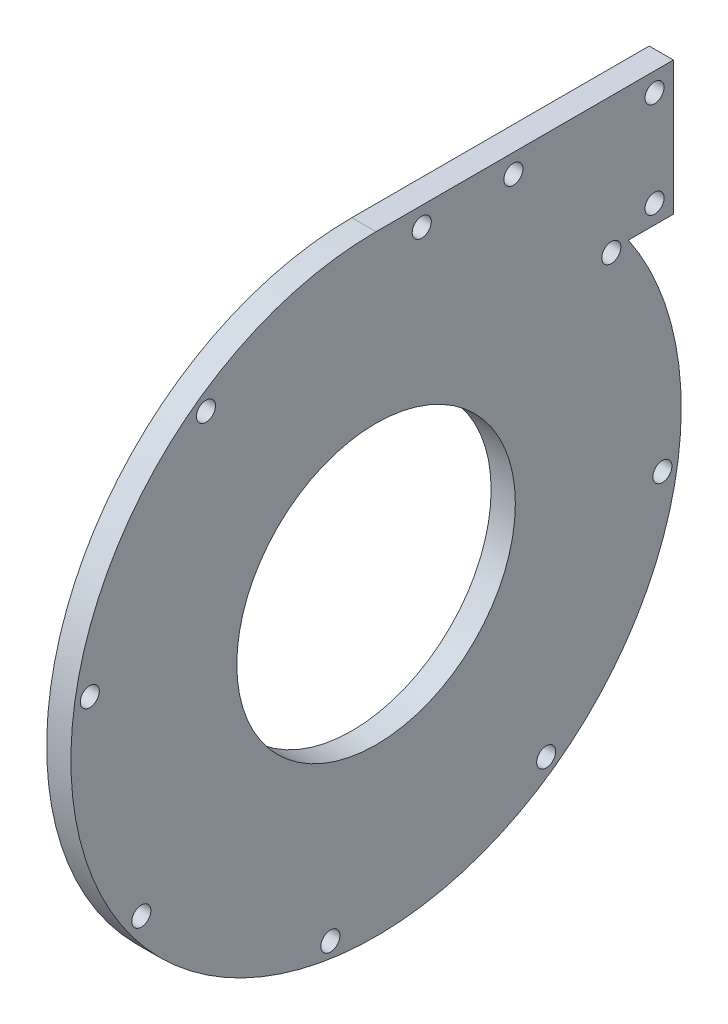
ISO-10303-21;
HEADER;
FILE_DESCRIPTION(('STEP AP214'),'2;1');
FILE_NAME('part.step','',(''),(''),'','','');
FILE_SCHEMA(('AUTOMOTIVE_DESIGN { 1 0 10303 214 1 1 1 1 }'));
ENDSEC;
DATA;
#1=APPLICATION_CONTEXT('core data for automotive mechanical design processes');
#2=APPLICATION_PROTOCOL_DEFINITION('international standard','automotive_design',2000,#1);
#3=PRODUCT_CONTEXT('',#1,'mechanical');
#4=PRODUCT('Part','Part','',(#3));
#5=PRODUCT_RELATED_PRODUCT_CATEGORY('part','',(#4));
#6=PRODUCT_DEFINITION_FORMATION('','',#4);
#7=PRODUCT_DEFINITION_CONTEXT('part definition',#1,'design');
#8=PRODUCT_DEFINITION('design','',#6,#7);
#9=PRODUCT_DEFINITION_SHAPE('','',#8);
#10=(LENGTH_UNIT() NAMED_UNIT(*) SI_UNIT(.MILLI.,.METRE.));
#11=(NAMED_UNIT(*) PLANE_ANGLE_UNIT() SI_UNIT($,.RADIAN.));
#12=(NAMED_UNIT(*) SI_UNIT($,.STERADIAN.) SOLID_ANGLE_UNIT());
#13=UNCERTAINTY_MEASURE_WITH_UNIT(LENGTH_MEASURE(1.E-05),#10,'distance_accuracy_value','');
#14=(GEOMETRIC_REPRESENTATION_CONTEXT(3) GLOBAL_UNCERTAINTY_ASSIGNED_CONTEXT((#13)) GLOBAL_UNIT_ASSIGNED_CONTEXT((#10,
#11,#12)) REPRESENTATION_CONTEXT('',''));
#15=CARTESIAN_POINT('',(0.,0.,0.));
#16=DIRECTION('',(0.,0.,1.));
#17=DIRECTION('',(1.,0.,0.));
#18=AXIS2_PLACEMENT_3D('',#15,#16,#17);
#19=CARTESIAN_POINT('',(6.35,0.,2.77555756156289E-13));
#20=DIRECTION('',(1.,0.,0.));
#21=DIRECTION('',(0.,0.,-1.));
#22=AXIS2_PLACEMENT_3D('',#19,#20,#21);
#23=PLANE('',#22);
#24=CARTESIAN_POINT('',(6.35,44.4223973139717,-61.6656356237381));
#25=DIRECTION('',(1.,0.,0.));
#26=DIRECTION('',(0.,0.,-1.));
#27=AXIS2_PLACEMENT_3D('',#24,#25,#26);
#28=CIRCLE('',#27,2.50000000000001);
#29=CARTESIAN_POINT('',(6.35,44.4223973139717,-64.1656356237381));
#30=VERTEX_POINT('',#29);
#31=EDGE_CURVE('E179',#30,#30,#28,.T.);
#32=ORIENTED_EDGE('',*,*,#31,.F.);
#33=EDGE_LOOP('',(#32));
#34=FACE_BOUND('',#33,.T.);
#35=CARTESIAN_POINT('',(6.35,49.95,-73.));
#36=DIRECTION('',(1.,0.,0.));
#37=DIRECTION('',(0.,0.,-1.));
#38=AXIS2_PLACEMENT_3D('',#35,#36,#37);
#39=CIRCLE('',#38,2.5);
#40=CARTESIAN_POINT('',(6.35,49.95,-75.5));
#41=VERTEX_POINT('',#40);
#42=EDGE_CURVE('E173',#41,#41,#39,.T.);
#43=ORIENTED_EDGE('',*,*,#42,.F.);
#44=EDGE_LOOP('',(#43));
#45=FACE_BOUND('',#44,.T.);
#46=CARTESIAN_POINT('',(6.35,75.05,-73.));
#47=DIRECTION('',(1.,0.,0.));
#48=DIRECTION('',(0.,0.,-1.));
#49=AXIS2_PLACEMENT_3D('',#46,#47,#48);
#50=CIRCLE('',#49,2.5);
#51=CARTESIAN_POINT('',(6.35,75.05,-75.5));
#52=VERTEX_POINT('',#51);
#53=EDGE_CURVE('E167',#52,#52,#50,.T.);
#54=ORIENTED_EDGE('',*,*,#53,.F.);
#55=EDGE_LOOP('',(#54));
#56=FACE_BOUND('',#55,.T.);
#57=CARTESIAN_POINT('',(6.35,75.05,-36.));
#58=DIRECTION('',(1.,0.,0.));
#59=DIRECTION('',(0.,0.,-1.));
#60=AXIS2_PLACEMENT_3D('',#57,#58,#59);
#61=CIRCLE('',#60,2.5);
#62=CARTESIAN_POINT('',(6.35,75.05,-38.5));
#63=VERTEX_POINT('',#62);
#64=EDGE_CURVE('E161',#63,#63,#61,.T.);
#65=ORIENTED_EDGE('',*,*,#64,.F.);
#66=EDGE_LOOP('',(#65));
#67=FACE_BOUND('',#66,.T.);
#68=CARTESIAN_POINT('',(6.35,-11.9790442022717,-75.0500000000001));
#69=DIRECTION('',(1.,0.,0.));
#70=DIRECTION('',(0.,-1.,0.));
#71=AXIS2_PLACEMENT_3D('',#68,#69,#70);
#72=CIRCLE('',#71,2.5);
#73=CARTESIAN_POINT('',(6.35,-14.4790442022717,-75.0500000000002));
#74=VERTEX_POINT('',#73);
#75=EDGE_CURVE('E155',#74,#74,#72,.T.);
#76=ORIENTED_EDGE('',*,*,#75,.F.);
#77=EDGE_LOOP('',(#76));
#78=FACE_BOUND('',#77,.T.);
#79=CARTESIAN_POINT('',(6.35,-61.5388273156103,-44.5979005404906));
#80=DIRECTION('',(1.,0.,0.));
#81=DIRECTION('',(0.,-0.707106781186554,0.707106781186541));
#82=AXIS2_PLACEMENT_3D('',#79,#80,#81);
#83=CIRCLE('',#82,2.5);
#84=CARTESIAN_POINT('',(6.35,-63.3065942685767,-42.8301335875243));
#85=VERTEX_POINT('',#84);
#86=EDGE_CURVE('E149',#85,#85,#83,.T.);
#87=ORIENTED_EDGE('',*,*,#86,.F.);
#88=EDGE_LOOP('',(#87));
#89=FACE_BOUND('',#88,.T.);
#90=CARTESIAN_POINT('',(6.35,-75.05,11.9790442022725));
#91=DIRECTION('',(1.,0.,0.));
#92=DIRECTION('',(0.,0.,1.));
#93=AXIS2_PLACEMENT_3D('',#90,#91,#92);
#94=CIRCLE('',#93,2.5);
#95=CARTESIAN_POINT('',(6.35,-75.05,14.4790442022725));
#96=VERTEX_POINT('',#95);
#97=EDGE_CURVE('E143',#96,#96,#94,.T.);
#98=ORIENTED_EDGE('',*,*,#97,.F.);
#99=EDGE_LOOP('',(#98));
#100=FACE_BOUND('',#99,.T.);
#101=CARTESIAN_POINT('',(6.35,-44.5979005404904,61.5388273156105));
#102=DIRECTION('',(1.,0.,0.));
#103=DIRECTION('',(0.,0.707106781186544,0.707106781186551));
#104=AXIS2_PLACEMENT_3D('',#101,#102,#103);
#105=CIRCLE('',#104,2.5);
#106=CARTESIAN_POINT('',(6.35,-42.8301335875241,63.3065942685768));
#107=VERTEX_POINT('',#106);
#108=EDGE_CURVE('E137',#107,#107,#105,.T.);
#109=ORIENTED_EDGE('',*,*,#108,.F.);
#110=EDGE_LOOP('',(#109));
#111=FACE_BOUND('',#110,.T.);
#112=CARTESIAN_POINT('',(6.35,11.9790442022723,75.0500000000001));
#113=DIRECTION('',(1.,0.,0.));
#114=DIRECTION('',(0.,1.,0.));
#115=AXIS2_PLACEMENT_3D('',#112,#113,#114);
#116=CIRCLE('',#115,2.5);
#117=CARTESIAN_POINT('',(6.35,14.4790442022723,75.0500000000001));
#118=VERTEX_POINT('',#117);
#119=EDGE_CURVE('E131',#118,#118,#116,.T.);
#120=ORIENTED_EDGE('',*,*,#119,.F.);
#121=EDGE_LOOP('',(#120));
#122=FACE_BOUND('',#121,.T.);
#123=CARTESIAN_POINT('',(6.35,61.5388273156106,44.5979005404902));
#124=DIRECTION('',(1.,0.,0.));
#125=DIRECTION('',(0.,0.707106781186549,-0.707106781186546));
#126=AXIS2_PLACEMENT_3D('',#123,#124,#125);
#127=CIRCLE('',#126,2.5);
#128=CARTESIAN_POINT('',(6.35,63.306594268577,42.8301335875238));
#129=VERTEX_POINT('',#128);
#130=EDGE_CURVE('E125',#129,#129,#127,.T.);
#131=ORIENTED_EDGE('',*,*,#130,.F.);
#132=EDGE_LOOP('',(#131));
#133=FACE_BOUND('',#132,.T.);
#134=CARTESIAN_POINT('',(6.35,75.05,-11.9790442022725));
#135=DIRECTION('',(1.,0.,0.));
#136=DIRECTION('',(0.,0.,-1.));
#137=AXIS2_PLACEMENT_3D('',#134,#135,#136);
#138=CIRCLE('',#137,2.5);
#139=CARTESIAN_POINT('',(6.35,75.05,-14.4790442022725));
#140=VERTEX_POINT('',#139);
#141=EDGE_CURVE('E119',#140,#140,#138,.T.);
#142=ORIENTED_EDGE('',*,*,#141,.F.);
#143=EDGE_LOOP('',(#142));
#144=FACE_BOUND('',#143,.T.);
#145=DIRECTION('',(0.,1.,0.));
#146=VECTOR('',#145,1.);
#147=CARTESIAN_POINT('',(6.35,45.,-77.9499999999997));
#148=LINE('',#147,#146);
#149=CARTESIAN_POINT('',(6.35,45.,-77.9499999999997));
#150=VERTEX_POINT('',#149);
#151=CARTESIAN_POINT('',(6.35,80.,-77.9499999999997));
#152=VERTEX_POINT('',#151);
#153=EDGE_CURVE('E86',#150,#152,#148,.T.);
#154=ORIENTED_EDGE('',*,*,#153,.T.);
#155=DIRECTION('',(0.,0.,1.));
#156=VECTOR('',#155,1.);
#157=CARTESIAN_POINT('',(6.35,80.,-77.9499999999997));
#158=LINE('',#157,#156);
#159=CARTESIAN_POINT('',(6.35,80.,2.77555756156289E-13));
#160=VERTEX_POINT('',#159);
#161=EDGE_CURVE('E81',#152,#160,#158,.T.);
#162=ORIENTED_EDGE('',*,*,#161,.T.);
#163=CARTESIAN_POINT('',(6.35,0.,2.77555756156289E-13));
#164=DIRECTION('',(1.,0.,0.));
#165=DIRECTION('',(0.,0.,-1.));
#166=AXIS2_PLACEMENT_3D('',#163,#164,#165);
#167=CIRCLE('',#166,80.);
#168=CARTESIAN_POINT('',(6.35,45.,-66.1437827766145));
#169=VERTEX_POINT('',#168);
#170=EDGE_CURVE('E84',#160,#169,#167,.T.);
#171=ORIENTED_EDGE('',*,*,#170,.T.);
#172=DIRECTION('',(0.,0.,-1.));
#173=VECTOR('',#172,1.);
#174=CARTESIAN_POINT('',(6.35,45.,-66.1437827766145));
#175=LINE('',#174,#173);
#176=EDGE_CURVE('E51',#169,#150,#175,.T.);
#177=ORIENTED_EDGE('',*,*,#176,.T.);
#178=EDGE_LOOP('',(#154,#162,#171,#177));
#179=FACE_BOUND('',#178,.T.);
#180=CARTESIAN_POINT('',(6.35,0.,2.77555756156289E-13));
#181=DIRECTION('',(1.,0.,0.));
#182=DIRECTION('',(0.,0.,-1.));
#183=AXIS2_PLACEMENT_3D('',#180,#181,#182);
#184=CIRCLE('',#183,36.5125000000003);
#185=CARTESIAN_POINT('',(6.35,0.,-36.5125));
#186=VERTEX_POINT('',#185);
#187=EDGE_CURVE('E101',#186,#186,#184,.T.);
#188=ORIENTED_EDGE('',*,*,#187,.F.);
#189=EDGE_LOOP('',(#188));
#190=FACE_BOUND('',#189,.T.);
#191=ADVANCED_FACE('F34',(#34,#45,#56,#67,#78,#89,#100,#111,#122,#133,#144,#179,#190),#23,.T.);
#192=CARTESIAN_POINT('',(0.,0.,2.77555756156289E-13));
#193=DIRECTION('',(1.,0.,0.));
#194=DIRECTION('',(0.,0.,-1.));
#195=AXIS2_PLACEMENT_3D('',#192,#193,#194);
#196=PLANE('',#195);
#197=CARTESIAN_POINT('',(0.,44.4223973139717,-61.6656356237381));
#198=DIRECTION('',(1.,0.,0.));
#199=DIRECTION('',(0.,0.,-1.));
#200=AXIS2_PLACEMENT_3D('',#197,#198,#199);
#201=CIRCLE('',#200,2.50000000000001);
#202=CARTESIAN_POINT('',(0.,44.4223973139717,-64.1656356237381));
#203=VERTEX_POINT('',#202);
#204=EDGE_CURVE('E176',#203,#203,#201,.T.);
#205=ORIENTED_EDGE('',*,*,#204,.T.);
#206=EDGE_LOOP('',(#205));
#207=FACE_BOUND('',#206,.T.);
#208=CARTESIAN_POINT('',(0.,49.95,-73.));
#209=DIRECTION('',(1.,0.,0.));
#210=DIRECTION('',(0.,0.,-1.));
#211=AXIS2_PLACEMENT_3D('',#208,#209,#210);
#212=CIRCLE('',#211,2.5);
#213=CARTESIAN_POINT('',(0.,49.95,-75.5));
#214=VERTEX_POINT('',#213);
#215=EDGE_CURVE('E170',#214,#214,#212,.T.);
#216=ORIENTED_EDGE('',*,*,#215,.T.);
#217=EDGE_LOOP('',(#216));
#218=FACE_BOUND('',#217,.T.);
#219=CARTESIAN_POINT('',(0.,75.05,-73.));
#220=DIRECTION('',(1.,0.,0.));
#221=DIRECTION('',(0.,0.,-1.));
#222=AXIS2_PLACEMENT_3D('',#219,#220,#221);
#223=CIRCLE('',#222,2.5);
#224=CARTESIAN_POINT('',(0.,75.05,-75.5));
#225=VERTEX_POINT('',#224);
#226=EDGE_CURVE('E164',#225,#225,#223,.T.);
#227=ORIENTED_EDGE('',*,*,#226,.T.);
#228=EDGE_LOOP('',(#227));
#229=FACE_BOUND('',#228,.T.);
#230=CARTESIAN_POINT('',(0.,75.05,-36.));
#231=DIRECTION('',(1.,0.,0.));
#232=DIRECTION('',(0.,0.,-1.));
#233=AXIS2_PLACEMENT_3D('',#230,#231,#232);
#234=CIRCLE('',#233,2.5);
#235=CARTESIAN_POINT('',(0.,75.05,-38.5));
#236=VERTEX_POINT('',#235);
#237=EDGE_CURVE('E158',#236,#236,#234,.T.);
#238=ORIENTED_EDGE('',*,*,#237,.T.);
#239=EDGE_LOOP('',(#238));
#240=FACE_BOUND('',#239,.T.);
#241=CARTESIAN_POINT('',(0.,-11.9790442022717,-75.0500000000001));
#242=DIRECTION('',(1.,0.,0.));
#243=DIRECTION('',(0.,-1.,0.));
#244=AXIS2_PLACEMENT_3D('',#241,#242,#243);
#245=CIRCLE('',#244,2.5);
#246=CARTESIAN_POINT('',(0.,-14.4790442022717,-75.0500000000002));
#247=VERTEX_POINT('',#246);
#248=EDGE_CURVE('E152',#247,#247,#245,.T.);
#249=ORIENTED_EDGE('',*,*,#248,.T.);
#250=EDGE_LOOP('',(#249));
#251=FACE_BOUND('',#250,.T.);
#252=CARTESIAN_POINT('',(0.,-61.5388273156103,-44.5979005404906));
#253=DIRECTION('',(1.,0.,0.));
#254=DIRECTION('',(0.,-0.707106781186554,0.707106781186541));
#255=AXIS2_PLACEMENT_3D('',#252,#253,#254);
#256=CIRCLE('',#255,2.5);
#257=CARTESIAN_POINT('',(0.,-63.3065942685767,-42.8301335875243));
#258=VERTEX_POINT('',#257);
#259=EDGE_CURVE('E146',#258,#258,#256,.T.);
#260=ORIENTED_EDGE('',*,*,#259,.T.);
#261=EDGE_LOOP('',(#260));
#262=FACE_BOUND('',#261,.T.);
#263=CARTESIAN_POINT('',(0.,-75.05,11.9790442022725));
#264=DIRECTION('',(1.,0.,0.));
#265=DIRECTION('',(0.,0.,1.));
#266=AXIS2_PLACEMENT_3D('',#263,#264,#265);
#267=CIRCLE('',#266,2.5);
#268=CARTESIAN_POINT('',(0.,-75.05,14.4790442022725));
#269=VERTEX_POINT('',#268);
#270=EDGE_CURVE('E140',#269,#269,#267,.T.);
#271=ORIENTED_EDGE('',*,*,#270,.T.);
#272=EDGE_LOOP('',(#271));
#273=FACE_BOUND('',#272,.T.);
#274=CARTESIAN_POINT('',(0.,-44.5979005404904,61.5388273156105));
#275=DIRECTION('',(1.,0.,0.));
#276=DIRECTION('',(0.,0.707106781186544,0.707106781186551));
#277=AXIS2_PLACEMENT_3D('',#274,#275,#276);
#278=CIRCLE('',#277,2.5);
#279=CARTESIAN_POINT('',(0.,-42.8301335875241,63.3065942685768));
#280=VERTEX_POINT('',#279);
#281=EDGE_CURVE('E134',#280,#280,#278,.T.);
#282=ORIENTED_EDGE('',*,*,#281,.T.);
#283=EDGE_LOOP('',(#282));
#284=FACE_BOUND('',#283,.T.);
#285=CARTESIAN_POINT('',(0.,11.9790442022723,75.0500000000001));
#286=DIRECTION('',(1.,0.,0.));
#287=DIRECTION('',(0.,1.,0.));
#288=AXIS2_PLACEMENT_3D('',#285,#286,#287);
#289=CIRCLE('',#288,2.5);
#290=CARTESIAN_POINT('',(0.,14.4790442022723,75.0500000000001));
#291=VERTEX_POINT('',#290);
#292=EDGE_CURVE('E128',#291,#291,#289,.T.);
#293=ORIENTED_EDGE('',*,*,#292,.T.);
#294=EDGE_LOOP('',(#293));
#295=FACE_BOUND('',#294,.T.);
#296=CARTESIAN_POINT('',(0.,61.5388273156106,44.5979005404902));
#297=DIRECTION('',(1.,0.,0.));
#298=DIRECTION('',(0.,0.707106781186549,-0.707106781186546));
#299=AXIS2_PLACEMENT_3D('',#296,#297,#298);
#300=CIRCLE('',#299,2.5);
#301=CARTESIAN_POINT('',(0.,63.306594268577,42.8301335875238));
#302=VERTEX_POINT('',#301);
#303=EDGE_CURVE('E122',#302,#302,#300,.T.);
#304=ORIENTED_EDGE('',*,*,#303,.T.);
#305=EDGE_LOOP('',(#304));
#306=FACE_BOUND('',#305,.T.);
#307=CARTESIAN_POINT('',(0.,75.05,-11.9790442022725));
#308=DIRECTION('',(1.,0.,0.));
#309=DIRECTION('',(0.,0.,-1.));
#310=AXIS2_PLACEMENT_3D('',#307,#308,#309);
#311=CIRCLE('',#310,2.5);
#312=CARTESIAN_POINT('',(0.,75.05,-14.4790442022725));
#313=VERTEX_POINT('',#312);
#314=EDGE_CURVE('E116',#313,#313,#311,.T.);
#315=ORIENTED_EDGE('',*,*,#314,.T.);
#316=EDGE_LOOP('',(#315));
#317=FACE_BOUND('',#316,.T.);
#318=DIRECTION('',(0.,1.,0.));
#319=VECTOR('',#318,1.);
#320=CARTESIAN_POINT('',(0.,45.,-77.9499999999997));
#321=LINE('',#320,#319);
#322=CARTESIAN_POINT('',(0.,45.,-77.9499999999997));
#323=VERTEX_POINT('',#322);
#324=CARTESIAN_POINT('',(0.,80.,-77.9499999999997));
#325=VERTEX_POINT('',#324);
#326=EDGE_CURVE('E98',#323,#325,#321,.T.);
#327=ORIENTED_EDGE('',*,*,#326,.F.);
#328=DIRECTION('',(0.,0.,-1.));
#329=VECTOR('',#328,1.);
#330=CARTESIAN_POINT('',(0.,45.,-66.1437827766145));
#331=LINE('',#330,#329);
#332=CARTESIAN_POINT('',(0.,45.,-66.1437827766145));
#333=VERTEX_POINT('',#332);
#334=EDGE_CURVE('E74',#333,#323,#331,.T.);
#335=ORIENTED_EDGE('',*,*,#334,.F.);
#336=CARTESIAN_POINT('',(0.,0.,2.77555756156289E-13));
#337=DIRECTION('',(1.,0.,0.));
#338=DIRECTION('',(0.,0.,-1.));
#339=AXIS2_PLACEMENT_3D('',#336,#337,#338);
#340=CIRCLE('',#339,80.);
#341=CARTESIAN_POINT('',(0.,80.,2.77555756156289E-13));
#342=VERTEX_POINT('',#341);
#343=EDGE_CURVE('E68',#342,#333,#340,.T.);
#344=ORIENTED_EDGE('',*,*,#343,.F.);
#345=DIRECTION('',(0.,0.,1.));
#346=VECTOR('',#345,1.);
#347=CARTESIAN_POINT('',(0.,80.,-77.9499999999997));
#348=LINE('',#347,#346);
#349=EDGE_CURVE('E90',#325,#342,#348,.T.);
#350=ORIENTED_EDGE('',*,*,#349,.F.);
#351=EDGE_LOOP('',(#327,#335,#344,#350));
#352=FACE_BOUND('',#351,.T.);
#353=CARTESIAN_POINT('',(0.,0.,2.77555756156289E-13));
#354=DIRECTION('',(1.,0.,0.));
#355=DIRECTION('',(0.,0.,-1.));
#356=AXIS2_PLACEMENT_3D('',#353,#354,#355);
#357=CIRCLE('',#356,36.5125000000003);
#358=CARTESIAN_POINT('',(0.,0.,-36.5125));
#359=VERTEX_POINT('',#358);
#360=EDGE_CURVE('E113',#359,#359,#357,.T.);
#361=ORIENTED_EDGE('',*,*,#360,.T.);
#362=EDGE_LOOP('',(#361));
#363=FACE_BOUND('',#362,.T.);
#364=ADVANCED_FACE('F109',(#207,#218,#229,#240,#251,#262,#273,#284,#295,#306,#317,#352,#363),
#196,.F.);
#365=CARTESIAN_POINT('',(6.35,45.,-77.9499999999997));
#366=DIRECTION('',(0.,0.,1.));
#367=DIRECTION('',(1.,0.,0.));
#368=AXIS2_PLACEMENT_3D('',#365,#366,#367);
#369=PLANE('',#368);
#370=ORIENTED_EDGE('',*,*,#326,.T.);
#371=DIRECTION('',(-1.,0.,0.));
#372=VECTOR('',#371,1.);
#373=CARTESIAN_POINT('',(6.35,80.,-77.9499999999997));
#374=LINE('',#373,#372);
#375=EDGE_CURVE('E11',#152,#325,#374,.T.);
#376=ORIENTED_EDGE('',*,*,#375,.F.);
#377=ORIENTED_EDGE('',*,*,#153,.F.);
#378=DIRECTION('',(-1.,0.,0.));
#379=VECTOR('',#378,1.);
#380=CARTESIAN_POINT('',(6.35,45.,-77.9499999999997));
#381=LINE('',#380,#379);
#382=EDGE_CURVE('E94',#150,#323,#381,.T.);
#383=ORIENTED_EDGE('',*,*,#382,.T.);
#384=EDGE_LOOP('',(#370,#376,#377,#383));
#385=FACE_BOUND('',#384,.T.);
#386=ADVANCED_FACE('F36',(#385),#369,.F.);
#387=CARTESIAN_POINT('',(6.35,80.,-77.9499999999997));
#388=DIRECTION('',(0.,-1.,0.));
#389=DIRECTION('',(0.,0.,-1.));
#390=AXIS2_PLACEMENT_3D('',#387,#388,#389);
#391=PLANE('',#390);
#392=ORIENTED_EDGE('',*,*,#349,.T.);
#393=DIRECTION('',(-1.,0.,0.));
#394=VECTOR('',#393,1.);
#395=CARTESIAN_POINT('',(6.35,80.,2.77555756156289E-13));
#396=LINE('',#395,#394);
#397=EDGE_CURVE('E43',#160,#342,#396,.T.);
#398=ORIENTED_EDGE('',*,*,#397,.F.);
#399=ORIENTED_EDGE('',*,*,#161,.F.);
#400=ORIENTED_EDGE('',*,*,#375,.T.);
#401=EDGE_LOOP('',(#392,#398,#399,#400));
#402=FACE_BOUND('',#401,.T.);
#403=ADVANCED_FACE('F89',(#402),#391,.F.);
#404=CARTESIAN_POINT('',(6.35,0.,2.77555756156289E-13));
#405=DIRECTION('',(-1.,0.,0.));
#406=DIRECTION('',(0.,0.,1.));
#407=AXIS2_PLACEMENT_3D('',#404,#405,#406);
#408=CYLINDRICAL_SURFACE('',#407,80.);
#409=ORIENTED_EDGE('',*,*,#343,.T.);
#410=DIRECTION('',(-1.,0.,0.));
#411=VECTOR('',#410,1.);
#412=CARTESIAN_POINT('',(6.35,45.,-66.1437827766145));
#413=LINE('',#412,#411);
#414=EDGE_CURVE('E91',#169,#333,#413,.T.);
#415=ORIENTED_EDGE('',*,*,#414,.F.);
#416=ORIENTED_EDGE('',*,*,#170,.F.);
#417=ORIENTED_EDGE('',*,*,#397,.T.);
#418=EDGE_LOOP('',(#409,#415,#416,#417));
#419=FACE_BOUND('',#418,.T.);
#420=ADVANCED_FACE('F92',(#419),#408,.T.);
#421=CARTESIAN_POINT('',(6.35,45.,-66.1437827766145));
#422=DIRECTION('',(0.,1.,0.));
#423=DIRECTION('',(0.,0.,1.));
#424=AXIS2_PLACEMENT_3D('',#421,#422,#423);
#425=PLANE('',#424);
#426=ORIENTED_EDGE('',*,*,#334,.T.);
#427=ORIENTED_EDGE('',*,*,#382,.F.);
#428=ORIENTED_EDGE('',*,*,#176,.F.);
#429=ORIENTED_EDGE('',*,*,#414,.T.);
#430=EDGE_LOOP('',(#426,#427,#428,#429));
#431=FACE_BOUND('',#430,.T.);
#432=ADVANCED_FACE('F106',(#431),#425,.F.);
#433=CARTESIAN_POINT('',(6.35,0.,2.77555756156289E-13));
#434=DIRECTION('',(-1.,0.,0.));
#435=DIRECTION('',(0.,0.,1.));
#436=AXIS2_PLACEMENT_3D('',#433,#434,#435);
#437=CYLINDRICAL_SURFACE('',#436,36.5125000000003);
#438=ORIENTED_EDGE('',*,*,#187,.T.);
#439=EDGE_LOOP('',(#438));
#440=FACE_BOUND('',#439,.T.);
#441=ORIENTED_EDGE('',*,*,#360,.F.);
#442=EDGE_LOOP('',(#441));
#443=FACE_BOUND('',#442,.T.);
#444=ADVANCED_FACE('F220',(#440,#443),#437,.F.);
#445=CARTESIAN_POINT('',(0.,75.05,-11.9790442022725));
#446=DIRECTION('',(1.,0.,0.));
#447=DIRECTION('',(0.,0.,-1.));
#448=AXIS2_PLACEMENT_3D('',#445,#446,#447);
#449=CYLINDRICAL_SURFACE('',#448,2.5);
#450=ORIENTED_EDGE('',*,*,#314,.F.);
#451=EDGE_LOOP('',(#450));
#452=FACE_BOUND('',#451,.T.);
#453=ORIENTED_EDGE('',*,*,#141,.T.);
#454=EDGE_LOOP('',(#453));
#455=FACE_BOUND('',#454,.T.);
#456=ADVANCED_FACE('F217',(#452,#455),#449,.F.);
#457=CARTESIAN_POINT('',(0.,61.5388273156106,44.5979005404902));
#458=DIRECTION('',(1.,0.,0.));
#459=DIRECTION('',(0.,0.,-1.));
#460=AXIS2_PLACEMENT_3D('',#457,#458,#459);
#461=CYLINDRICAL_SURFACE('',#460,2.5);
#462=ORIENTED_EDGE('',*,*,#303,.F.);
#463=EDGE_LOOP('',(#462));
#464=FACE_BOUND('',#463,.T.);
#465=ORIENTED_EDGE('',*,*,#130,.T.);
#466=EDGE_LOOP('',(#465));
#467=FACE_BOUND('',#466,.T.);
#468=ADVANCED_FACE('F219',(#464,#467),#461,.F.);
#469=CARTESIAN_POINT('',(0.,11.9790442022723,75.0500000000001));
#470=DIRECTION('',(1.,0.,0.));
#471=DIRECTION('',(0.,0.,-1.));
#472=AXIS2_PLACEMENT_3D('',#469,#470,#471);
#473=CYLINDRICAL_SURFACE('',#472,2.5);
#474=ORIENTED_EDGE('',*,*,#292,.F.);
#475=EDGE_LOOP('',(#474));
#476=FACE_BOUND('',#475,.T.);
#477=ORIENTED_EDGE('',*,*,#119,.T.);
#478=EDGE_LOOP('',(#477));
#479=FACE_BOUND('',#478,.T.);
#480=ADVANCED_FACE('F227',(#476,#479),#473,.F.);
#481=CARTESIAN_POINT('',(0.,-44.5979005404904,61.5388273156105));
#482=DIRECTION('',(1.,0.,0.));
#483=DIRECTION('',(0.,0.,-1.));
#484=AXIS2_PLACEMENT_3D('',#481,#482,#483);
#485=CYLINDRICAL_SURFACE('',#484,2.5);
#486=ORIENTED_EDGE('',*,*,#281,.F.);
#487=EDGE_LOOP('',(#486));
#488=FACE_BOUND('',#487,.T.);
#489=ORIENTED_EDGE('',*,*,#108,.T.);
#490=EDGE_LOOP('',(#489));
#491=FACE_BOUND('',#490,.T.);
#492=ADVANCED_FACE('F288',(#488,#491),#485,.F.);
#493=CARTESIAN_POINT('',(0.,-75.05,11.9790442022725));
#494=DIRECTION('',(1.,0.,0.));
#495=DIRECTION('',(0.,0.,-1.));
#496=AXIS2_PLACEMENT_3D('',#493,#494,#495);
#497=CYLINDRICAL_SURFACE('',#496,2.5);
#498=ORIENTED_EDGE('',*,*,#270,.F.);
#499=EDGE_LOOP('',(#498));
#500=FACE_BOUND('',#499,.T.);
#501=ORIENTED_EDGE('',*,*,#97,.T.);
#502=EDGE_LOOP('',(#501));
#503=FACE_BOUND('',#502,.T.);
#504=ADVANCED_FACE('F278',(#500,#503),#497,.F.);
#505=CARTESIAN_POINT('',(0.,-61.5388273156103,-44.5979005404906));
#506=DIRECTION('',(1.,0.,0.));
#507=DIRECTION('',(0.,0.,-1.));
#508=AXIS2_PLACEMENT_3D('',#505,#506,#507);
#509=CYLINDRICAL_SURFACE('',#508,2.5);
#510=ORIENTED_EDGE('',*,*,#259,.F.);
#511=EDGE_LOOP('',(#510));
#512=FACE_BOUND('',#511,.T.);
#513=ORIENTED_EDGE('',*,*,#86,.T.);
#514=EDGE_LOOP('',(#513));
#515=FACE_BOUND('',#514,.T.);
#516=ADVANCED_FACE('F266',(#512,#515),#509,.F.);
#517=CARTESIAN_POINT('',(0.,-11.9790442022717,-75.0500000000001));
#518=DIRECTION('',(1.,0.,0.));
#519=DIRECTION('',(0.,0.,-1.));
#520=AXIS2_PLACEMENT_3D('',#517,#518,#519);
#521=CYLINDRICAL_SURFACE('',#520,2.5);
#522=ORIENTED_EDGE('',*,*,#248,.F.);
#523=EDGE_LOOP('',(#522));
#524=FACE_BOUND('',#523,.T.);
#525=ORIENTED_EDGE('',*,*,#75,.T.);
#526=EDGE_LOOP('',(#525));
#527=FACE_BOUND('',#526,.T.);
#528=ADVANCED_FACE('F260',(#524,#527),#521,.F.);
#529=CARTESIAN_POINT('',(0.,75.05,-36.));
#530=DIRECTION('',(1.,0.,0.));
#531=DIRECTION('',(0.,0.,-1.));
#532=AXIS2_PLACEMENT_3D('',#529,#530,#531);
#533=CYLINDRICAL_SURFACE('',#532,2.5);
#534=ORIENTED_EDGE('',*,*,#237,.F.);
#535=EDGE_LOOP('',(#534));
#536=FACE_BOUND('',#535,.T.);
#537=ORIENTED_EDGE('',*,*,#64,.T.);
#538=EDGE_LOOP('',(#537));
#539=FACE_BOUND('',#538,.T.);
#540=ADVANCED_FACE('F265',(#536,#539),#533,.F.);
#541=CARTESIAN_POINT('',(0.,75.05,-73.));
#542=DIRECTION('',(1.,0.,0.));
#543=DIRECTION('',(0.,0.,-1.));
#544=AXIS2_PLACEMENT_3D('',#541,#542,#543);
#545=CYLINDRICAL_SURFACE('',#544,2.5);
#546=ORIENTED_EDGE('',*,*,#226,.F.);
#547=EDGE_LOOP('',(#546));
#548=FACE_BOUND('',#547,.T.);
#549=ORIENTED_EDGE('',*,*,#53,.T.);
#550=EDGE_LOOP('',(#549));
#551=FACE_BOUND('',#550,.T.);
#552=ADVANCED_FACE('F350',(#548,#551),#545,.F.);
#553=CARTESIAN_POINT('',(0.,49.95,-73.));
#554=DIRECTION('',(1.,0.,0.));
#555=DIRECTION('',(0.,0.,-1.));
#556=AXIS2_PLACEMENT_3D('',#553,#554,#555);
#557=CYLINDRICAL_SURFACE('',#556,2.5);
#558=ORIENTED_EDGE('',*,*,#215,.F.);
#559=EDGE_LOOP('',(#558));
#560=FACE_BOUND('',#559,.T.);
#561=ORIENTED_EDGE('',*,*,#42,.T.);
#562=EDGE_LOOP('',(#561));
#563=FACE_BOUND('',#562,.T.);
#564=ADVANCED_FACE('F190',(#560,#563),#557,.F.);
#565=CARTESIAN_POINT('',(0.,44.4223973139717,-61.6656356237381));
#566=DIRECTION('',(1.,0.,0.));
#567=DIRECTION('',(0.,0.,-1.));
#568=AXIS2_PLACEMENT_3D('',#565,#566,#567);
#569=CYLINDRICAL_SURFACE('',#568,2.50000000000001);
#570=ORIENTED_EDGE('',*,*,#204,.F.);
#571=EDGE_LOOP('',(#570));
#572=FACE_BOUND('',#571,.T.);
#573=ORIENTED_EDGE('',*,*,#31,.T.);
#574=EDGE_LOOP('',(#573));
#575=FACE_BOUND('',#574,.T.);
#576=ADVANCED_FACE('F187',(#572,#575),#569,.F.);
#577=CLOSED_SHELL('',(#191,#364,#386,#403,#420,#432,#444,#456,#468,#480,#492,#504,#516,#528,
#540,#552,#564,#576));
#578=MANIFOLD_SOLID_BREP('B2',#577);
#579=ADVANCED_BREP_SHAPE_REPRESENTATION('',(#18,#578),#14);
#580=SHAPE_DEFINITION_REPRESENTATION(#9,#579);
ENDSEC;
END-ISO-10303-21;
